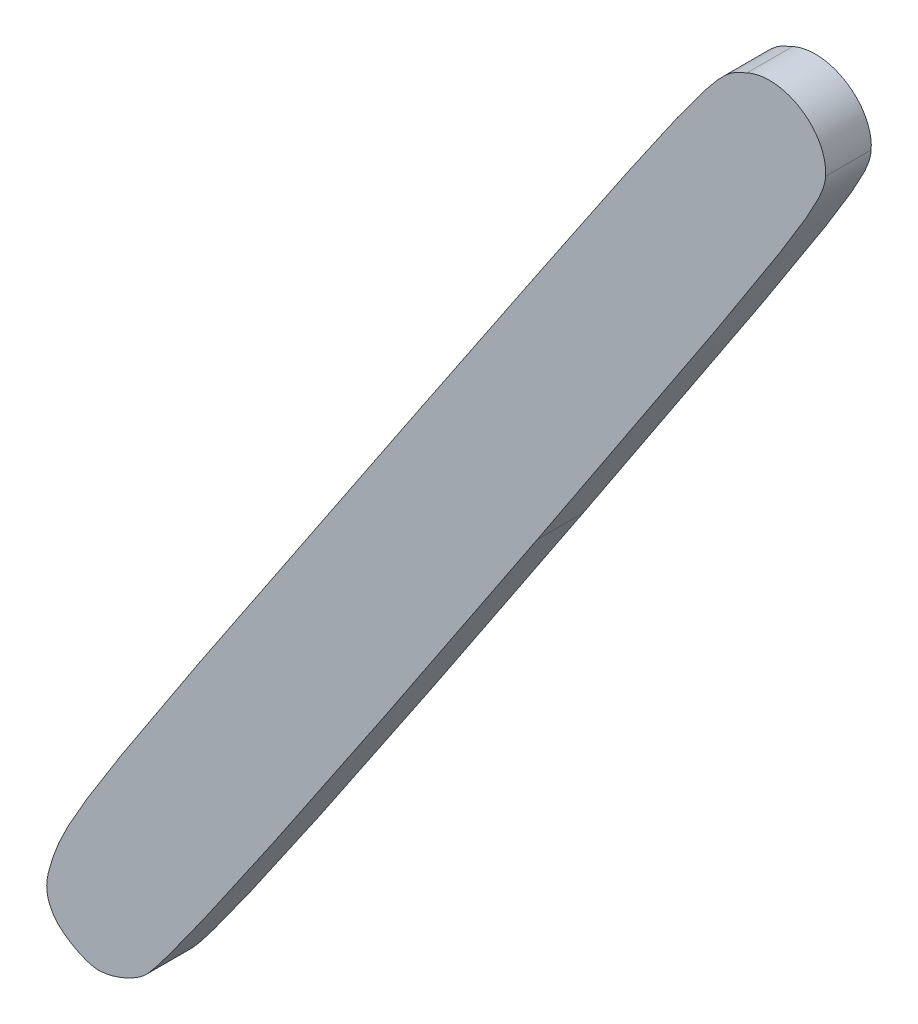
ISO-10303-21;
HEADER;
FILE_DESCRIPTION(('STEP AP214'),'2;1');
FILE_NAME('part.step','',(''),(''),'','','');
FILE_SCHEMA(('AUTOMOTIVE_DESIGN { 1 0 10303 214 1 1 1 1 }'));
ENDSEC;
DATA;
#1=APPLICATION_CONTEXT('core data for automotive mechanical design processes');
#2=APPLICATION_PROTOCOL_DEFINITION('international standard','automotive_design',2000,#1);
#3=PRODUCT_CONTEXT('',#1,'mechanical');
#4=PRODUCT('Part','Part','',(#3));
#5=PRODUCT_RELATED_PRODUCT_CATEGORY('part','',(#4));
#6=PRODUCT_DEFINITION_FORMATION('','',#4);
#7=PRODUCT_DEFINITION_CONTEXT('part definition',#1,'design');
#8=PRODUCT_DEFINITION('design','',#6,#7);
#9=PRODUCT_DEFINITION_SHAPE('','',#8);
#10=(LENGTH_UNIT() NAMED_UNIT(*) SI_UNIT(.MILLI.,.METRE.));
#11=(NAMED_UNIT(*) PLANE_ANGLE_UNIT() SI_UNIT($,.RADIAN.));
#12=(NAMED_UNIT(*) SI_UNIT($,.STERADIAN.) SOLID_ANGLE_UNIT());
#13=UNCERTAINTY_MEASURE_WITH_UNIT(LENGTH_MEASURE(1.E-05),#10,'distance_accuracy_value','');
#14=(GEOMETRIC_REPRESENTATION_CONTEXT(3) GLOBAL_UNCERTAINTY_ASSIGNED_CONTEXT((#13)) GLOBAL_UNIT_ASSIGNED_CONTEXT((#10,
#11,#12)) REPRESENTATION_CONTEXT('',''));
#15=CARTESIAN_POINT('',(0.,0.,0.));
#16=DIRECTION('',(0.,0.,1.));
#17=DIRECTION('',(1.,0.,0.));
#18=AXIS2_PLACEMENT_3D('',#15,#16,#17);
#19=CARTESIAN_POINT('',(-3.363204408535,-1.493037371071,0.));
#20=CARTESIAN_POINT('',(-3.363204408535,-1.493037371071,0.01));
#21=CARTESIAN_POINT('',(-3.370469439906,-1.496277458136,0.));
#22=CARTESIAN_POINT('',(-3.370469439906,-1.496277458136,0.01));
#23=CARTESIAN_POINT('',(-3.367841194732,-1.492614738418,0.));
#24=CARTESIAN_POINT('',(-3.367841194732,-1.492614738418,0.01));
#25=CARTESIAN_POINT('',(-3.43794680232,-1.597198231077,0.));
#26=CARTESIAN_POINT('',(-3.43794680232,-1.597198231077,0.01));
#27=B_SPLINE_SURFACE_WITH_KNOTS('',3,1,((#19,#20),(#21,#22),(#23,#24),(#25,#26)),.UNSPECIFIED.,
.F.,.F.,.F.,(4,4),(2,2),(0.,1.),(0.,0.001),.UNSPECIFIED.);
#28=CARTESIAN_POINT('',(-3.363204408535,-1.493037371071,0.));
#29=CARTESIAN_POINT('',(-3.370469439906,-1.496277458136,0.));
#30=CARTESIAN_POINT('',(-3.367841194732,-1.492614738418,0.));
#31=CARTESIAN_POINT('',(-3.43794680232,-1.597198231077,0.));
#32=B_SPLINE_CURVE_WITH_KNOTS('',3,(#28,#29,#30,#31),.UNSPECIFIED.,.F.,.F.,(4,4),(0.,1.),.UNSPECIFIED.);
#33=CARTESIAN_POINT('',(-3.363204408535,-1.493037371071,0.));
#34=VERTEX_POINT('',#33);
#35=CARTESIAN_POINT('',(-3.43794680232,-1.597198231077,0.));
#36=VERTEX_POINT('',#35);
#37=EDGE_CURVE('E11',#34,#36,#32,.T.);
#38=DIRECTION('',(0.,0.,1.));
#39=VECTOR('',#38,1.);
#40=CARTESIAN_POINT('',(-3.43794680232,-1.597198231077,0.));
#41=LINE('',#40,#39);
#42=CARTESIAN_POINT('',(-3.43794680232,-1.597198231077,0.01));
#43=VERTEX_POINT('',#42);
#44=EDGE_CURVE('E28',#36,#43,#41,.T.);
#45=CARTESIAN_POINT('',(-3.363204408535,-1.493037371071,0.01));
#46=CARTESIAN_POINT('',(-3.370469439906,-1.496277458136,0.01));
#47=CARTESIAN_POINT('',(-3.367841194732,-1.492614738418,0.01));
#48=CARTESIAN_POINT('',(-3.43794680232,-1.597198231077,0.01));
#49=B_SPLINE_CURVE_WITH_KNOTS('',3,(#45,#46,#47,#48),.UNSPECIFIED.,.F.,.F.,(4,4),(0.,1.),.UNSPECIFIED.);
#50=CARTESIAN_POINT('',(-3.363204408535,-1.493037371071,0.01));
#51=VERTEX_POINT('',#50);
#52=EDGE_CURVE('E104',#51,#43,#49,.T.);
#53=DIRECTION('',(0.,0.,1.));
#54=VECTOR('',#53,1.);
#55=CARTESIAN_POINT('',(-3.363204408535,-1.493037371071,0.));
#56=LINE('',#55,#54);
#57=EDGE_CURVE('E217',#34,#51,#56,.T.);
#58=ORIENTED_EDGE('',*,*,#37,.T.);
#59=ORIENTED_EDGE('',*,*,#44,.T.);
#60=ORIENTED_EDGE('',*,*,#52,.F.);
#61=ORIENTED_EDGE('',*,*,#57,.F.);
#62=EDGE_LOOP('',(#58,#59,#60,#61));
#63=FACE_BOUND('',#62,.T.);
#64=ADVANCED_FACE('F17',(#63),#27,.T.);
#65=CARTESIAN_POINT('',(-3.346025772482,-1.504066626343,0.));
#66=CARTESIAN_POINT('',(-3.346025772482,-1.504066626343,0.01));
#67=CARTESIAN_POINT('',(-3.345477865455,-1.495616921893,0.));
#68=CARTESIAN_POINT('',(-3.345477865455,-1.495616921893,0.01));
#69=CARTESIAN_POINT('',(-3.355114958135,-1.489429590917,0.));
#70=CARTESIAN_POINT('',(-3.355114958135,-1.489429590917,0.01));
#71=CARTESIAN_POINT('',(-3.363204408535,-1.493037371071,0.));
#72=CARTESIAN_POINT('',(-3.363204408535,-1.493037371071,0.01));
#73=B_SPLINE_SURFACE_WITH_KNOTS('',3,1,((#65,#66),(#67,#68),(#69,#70),(#71,#72)),.UNSPECIFIED.,
.F.,.F.,.F.,(4,4),(2,2),(0.,1.),(0.,0.001),.UNSPECIFIED.);
#74=CARTESIAN_POINT('',(-3.346025772482,-1.504066626343,0.));
#75=CARTESIAN_POINT('',(-3.345477865455,-1.495616921893,0.));
#76=CARTESIAN_POINT('',(-3.355114958135,-1.489429590917,0.));
#77=CARTESIAN_POINT('',(-3.363204408535,-1.493037371071,0.));
#78=B_SPLINE_CURVE_WITH_KNOTS('',3,(#74,#75,#76,#77),.UNSPECIFIED.,.F.,.F.,(4,4),(0.,1.),.UNSPECIFIED.);
#79=CARTESIAN_POINT('',(-3.346025772482,-1.504066626343,0.));
#80=VERTEX_POINT('',#79);
#81=EDGE_CURVE('E209',#80,#34,#78,.T.);
#82=CARTESIAN_POINT('',(-3.346025772482,-1.504066626343,0.01));
#83=CARTESIAN_POINT('',(-3.345477865455,-1.495616921893,0.01));
#84=CARTESIAN_POINT('',(-3.355114958135,-1.489429590917,0.01));
#85=CARTESIAN_POINT('',(-3.363204408535,-1.493037371071,0.01));
#86=B_SPLINE_CURVE_WITH_KNOTS('',3,(#82,#83,#84,#85),.UNSPECIFIED.,.F.,.F.,(4,4),(0.,1.),.UNSPECIFIED.);
#87=CARTESIAN_POINT('',(-3.346025772482,-1.504066626343,0.01));
#88=VERTEX_POINT('',#87);
#89=EDGE_CURVE('E205',#88,#51,#86,.T.);
#90=DIRECTION('',(0.,0.,1.));
#91=VECTOR('',#90,1.);
#92=CARTESIAN_POINT('',(-3.346025772482,-1.504066626343,0.));
#93=LINE('',#92,#91);
#94=EDGE_CURVE('E199',#80,#88,#93,.T.);
#95=ORIENTED_EDGE('',*,*,#81,.T.);
#96=ORIENTED_EDGE('',*,*,#57,.T.);
#97=ORIENTED_EDGE('',*,*,#89,.F.);
#98=ORIENTED_EDGE('',*,*,#94,.F.);
#99=EDGE_LOOP('',(#95,#96,#97,#98));
#100=FACE_BOUND('',#99,.T.);
#101=ADVANCED_FACE('F242',(#100),#73,.T.);
#102=CARTESIAN_POINT('',(-3.409126513595,-1.604467217313,0.));
#103=CARTESIAN_POINT('',(-3.409126513595,-1.604467217313,0.01));
#104=CARTESIAN_POINT('',(-3.351204575032,-1.517049252958,0.));
#105=CARTESIAN_POINT('',(-3.351204575032,-1.517049252958,0.01));
#106=CARTESIAN_POINT('',(-3.346368669837,-1.509354778062,0.));
#107=CARTESIAN_POINT('',(-3.346368669837,-1.509354778062,0.01));
#108=CARTESIAN_POINT('',(-3.346025772482,-1.504066626343,0.));
#109=CARTESIAN_POINT('',(-3.346025772482,-1.504066626343,0.01));
#110=B_SPLINE_SURFACE_WITH_KNOTS('',3,1,((#102,#103),(#104,#105),(#106,#107),(#108,#109)),
.UNSPECIFIED.,.F.,.F.,.F.,(4,4),(2,2),(0.,1.),(0.,0.001),.UNSPECIFIED.);
#111=CARTESIAN_POINT('',(-3.409126513595,-1.604467217313,0.));
#112=CARTESIAN_POINT('',(-3.351204575032,-1.517049252958,0.));
#113=CARTESIAN_POINT('',(-3.346368669837,-1.509354778062,0.));
#114=CARTESIAN_POINT('',(-3.346025772482,-1.504066626343,0.));
#115=B_SPLINE_CURVE_WITH_KNOTS('',3,(#111,#112,#113,#114),.UNSPECIFIED.,.F.,.F.,(4,4),(0.,1.),.UNSPECIFIED.);
#116=CARTESIAN_POINT('',(-3.409126513595,-1.604467217313,0.));
#117=VERTEX_POINT('',#116);
#118=EDGE_CURVE('E191',#117,#80,#115,.T.);
#119=CARTESIAN_POINT('',(-3.409126513595,-1.604467217313,0.01));
#120=CARTESIAN_POINT('',(-3.351204575032,-1.517049252958,0.01));
#121=CARTESIAN_POINT('',(-3.346368669837,-1.509354778062,0.01));
#122=CARTESIAN_POINT('',(-3.346025772482,-1.504066626343,0.01));
#123=B_SPLINE_CURVE_WITH_KNOTS('',3,(#119,#120,#121,#122),.UNSPECIFIED.,.F.,.F.,(4,4),(0.,1.),.UNSPECIFIED.);
#124=CARTESIAN_POINT('',(-3.409126513595,-1.604467217313,0.01));
#125=VERTEX_POINT('',#124);
#126=EDGE_CURVE('E186',#125,#88,#123,.T.);
#127=DIRECTION('',(0.,0.,1.));
#128=VECTOR('',#127,1.);
#129=CARTESIAN_POINT('',(-3.409126513595,-1.604467217313,0.));
#130=LINE('',#129,#128);
#131=EDGE_CURVE('E180',#117,#125,#130,.T.);
#132=ORIENTED_EDGE('',*,*,#118,.T.);
#133=ORIENTED_EDGE('',*,*,#94,.T.);
#134=ORIENTED_EDGE('',*,*,#126,.F.);
#135=ORIENTED_EDGE('',*,*,#131,.F.);
#136=EDGE_LOOP('',(#132,#133,#134,#135));
#137=FACE_BOUND('',#136,.T.);
#138=ADVANCED_FACE('F239',(#137),#110,.T.);
#139=CARTESIAN_POINT('',(-3.495259882787,-1.730248698032,0.));
#140=CARTESIAN_POINT('',(-3.495259882787,-1.730248698032,0.01));
#141=CARTESIAN_POINT('',(-3.490998030274,-1.72671930422,0.));
#142=CARTESIAN_POINT('',(-3.490998030274,-1.72671930422,0.01));
#143=CARTESIAN_POINT('',(-3.464193178519,-1.687575888235,0.));
#144=CARTESIAN_POINT('',(-3.464193178519,-1.687575888235,0.01));
#145=CARTESIAN_POINT('',(-3.409126513595,-1.604467217313,0.));
#146=CARTESIAN_POINT('',(-3.409126513595,-1.604467217313,0.01));
#147=B_SPLINE_SURFACE_WITH_KNOTS('',3,1,((#139,#140),(#141,#142),(#143,#144),(#145,#146)),
.UNSPECIFIED.,.F.,.F.,.F.,(4,4),(2,2),(0.,1.),(0.,0.001),.UNSPECIFIED.);
#148=CARTESIAN_POINT('',(-3.495259882787,-1.730248698032,0.));
#149=CARTESIAN_POINT('',(-3.490998030274,-1.72671930422,0.));
#150=CARTESIAN_POINT('',(-3.464193178519,-1.687575888235,0.));
#151=CARTESIAN_POINT('',(-3.409126513595,-1.604467217313,0.));
#152=B_SPLINE_CURVE_WITH_KNOTS('',3,(#148,#149,#150,#151),.UNSPECIFIED.,.F.,.F.,(4,4),(0.,1.),.UNSPECIFIED.);
#153=CARTESIAN_POINT('',(-3.495259882787,-1.730248698032,0.));
#154=VERTEX_POINT('',#153);
#155=EDGE_CURVE('E172',#154,#117,#152,.T.);
#156=CARTESIAN_POINT('',(-3.495259882787,-1.730248698032,0.01));
#157=CARTESIAN_POINT('',(-3.490998030274,-1.72671930422,0.01));
#158=CARTESIAN_POINT('',(-3.464193178519,-1.687575888235,0.01));
#159=CARTESIAN_POINT('',(-3.409126513595,-1.604467217313,0.01));
#160=B_SPLINE_CURVE_WITH_KNOTS('',3,(#156,#157,#158,#159),.UNSPECIFIED.,.F.,.F.,(4,4),(0.,1.),.UNSPECIFIED.);
#161=CARTESIAN_POINT('',(-3.495259882787,-1.730248698032,0.01));
#162=VERTEX_POINT('',#161);
#163=EDGE_CURVE('E167',#162,#125,#160,.T.);
#164=DIRECTION('',(0.,0.,1.));
#165=VECTOR('',#164,1.);
#166=CARTESIAN_POINT('',(-3.495259882787,-1.730248698032,0.));
#167=LINE('',#166,#165);
#168=EDGE_CURVE('E161',#154,#162,#167,.T.);
#169=ORIENTED_EDGE('',*,*,#155,.T.);
#170=ORIENTED_EDGE('',*,*,#131,.T.);
#171=ORIENTED_EDGE('',*,*,#163,.F.);
#172=ORIENTED_EDGE('',*,*,#168,.F.);
#173=EDGE_LOOP('',(#169,#170,#171,#172));
#174=FACE_BOUND('',#173,.T.);
#175=ADVANCED_FACE('F236',(#174),#147,.T.);
#176=CARTESIAN_POINT('',(-3.504956956897,-1.734200969805,0.));
#177=CARTESIAN_POINT('',(-3.504956956897,-1.734200969805,0.01));
#178=CARTESIAN_POINT('',(-3.501881399519,-1.734049101498,0.));
#179=CARTESIAN_POINT('',(-3.501881399519,-1.734049101498,0.01));
#180=CARTESIAN_POINT('',(-3.497879346239,-1.73241794344,0.));
#181=CARTESIAN_POINT('',(-3.497879346239,-1.73241794344,0.01));
#182=CARTESIAN_POINT('',(-3.495259882787,-1.730248698032,0.));
#183=CARTESIAN_POINT('',(-3.495259882787,-1.730248698032,0.01));
#184=B_SPLINE_SURFACE_WITH_KNOTS('',3,1,((#176,#177),(#178,#179),(#180,#181),(#182,#183)),
.UNSPECIFIED.,.F.,.F.,.F.,(4,4),(2,2),(0.,1.),(0.,0.001),.UNSPECIFIED.);
#185=CARTESIAN_POINT('',(-3.504956956897,-1.734200969805,0.));
#186=CARTESIAN_POINT('',(-3.501881399519,-1.734049101498,0.));
#187=CARTESIAN_POINT('',(-3.497879346239,-1.73241794344,0.));
#188=CARTESIAN_POINT('',(-3.495259882787,-1.730248698032,0.));
#189=B_SPLINE_CURVE_WITH_KNOTS('',3,(#185,#186,#187,#188),.UNSPECIFIED.,.F.,.F.,(4,4),(0.,1.),.UNSPECIFIED.);
#190=CARTESIAN_POINT('',(-3.504956956897,-1.734200969805,0.));
#191=VERTEX_POINT('',#190);
#192=EDGE_CURVE('E153',#191,#154,#189,.T.);
#193=CARTESIAN_POINT('',(-3.504956956897,-1.734200969805,0.01));
#194=CARTESIAN_POINT('',(-3.501881399519,-1.734049101498,0.01));
#195=CARTESIAN_POINT('',(-3.497879346239,-1.73241794344,0.01));
#196=CARTESIAN_POINT('',(-3.495259882787,-1.730248698032,0.01));
#197=B_SPLINE_CURVE_WITH_KNOTS('',3,(#193,#194,#195,#196),.UNSPECIFIED.,.F.,.F.,(4,4),(0.,1.),.UNSPECIFIED.);
#198=CARTESIAN_POINT('',(-3.504956956897,-1.734200969805,0.01));
#199=VERTEX_POINT('',#198);
#200=EDGE_CURVE('E148',#199,#162,#197,.T.);
#201=DIRECTION('',(0.,0.,1.));
#202=VECTOR('',#201,1.);
#203=CARTESIAN_POINT('',(-3.504956956897,-1.734200969805,0.));
#204=LINE('',#203,#202);
#205=EDGE_CURVE('E142',#191,#199,#204,.T.);
#206=ORIENTED_EDGE('',*,*,#192,.T.);
#207=ORIENTED_EDGE('',*,*,#168,.T.);
#208=ORIENTED_EDGE('',*,*,#200,.F.);
#209=ORIENTED_EDGE('',*,*,#205,.F.);
#210=EDGE_LOOP('',(#206,#207,#208,#209));
#211=FACE_BOUND('',#210,.T.);
#212=ADVANCED_FACE('F233',(#211),#184,.T.);
#213=CARTESIAN_POINT('',(-3.515107951758,-1.728566809935,0.));
#214=CARTESIAN_POINT('',(-3.515107951758,-1.728566809935,0.01));
#215=CARTESIAN_POINT('',(-3.513405786965,-1.731333447629,0.));
#216=CARTESIAN_POINT('',(-3.513405786965,-1.731333447629,0.01));
#217=CARTESIAN_POINT('',(-3.507971168558,-1.734349784325,0.));
#218=CARTESIAN_POINT('',(-3.507971168558,-1.734349784325,0.01));
#219=CARTESIAN_POINT('',(-3.504956956897,-1.734200969805,0.));
#220=CARTESIAN_POINT('',(-3.504956956897,-1.734200969805,0.01));
#221=B_SPLINE_SURFACE_WITH_KNOTS('',3,1,((#213,#214),(#215,#216),(#217,#218),(#219,#220)),
.UNSPECIFIED.,.F.,.F.,.F.,(4,4),(2,2),(0.,1.),(0.,0.001),.UNSPECIFIED.);
#222=CARTESIAN_POINT('',(-3.515107951758,-1.728566809935,0.));
#223=CARTESIAN_POINT('',(-3.513405786965,-1.731333447629,0.));
#224=CARTESIAN_POINT('',(-3.507971168558,-1.734349784325,0.));
#225=CARTESIAN_POINT('',(-3.504956956897,-1.734200969805,0.));
#226=B_SPLINE_CURVE_WITH_KNOTS('',3,(#222,#223,#224,#225),.UNSPECIFIED.,.F.,.F.,(4,4),(0.,1.),.UNSPECIFIED.);
#227=CARTESIAN_POINT('',(-3.515107951758,-1.728566809935,0.));
#228=VERTEX_POINT('',#227);
#229=EDGE_CURVE('E134',#228,#191,#226,.T.);
#230=CARTESIAN_POINT('',(-3.515107951758,-1.728566809935,0.01));
#231=CARTESIAN_POINT('',(-3.513405786965,-1.731333447629,0.01));
#232=CARTESIAN_POINT('',(-3.507971168558,-1.734349784325,0.01));
#233=CARTESIAN_POINT('',(-3.504956956897,-1.734200969805,0.01));
#234=B_SPLINE_CURVE_WITH_KNOTS('',3,(#230,#231,#232,#233),.UNSPECIFIED.,.F.,.F.,(4,4),(0.,1.),.UNSPECIFIED.);
#235=CARTESIAN_POINT('',(-3.515107951758,-1.728566809935,0.01));
#236=VERTEX_POINT('',#235);
#237=EDGE_CURVE('E130',#236,#199,#234,.T.);
#238=DIRECTION('',(0.,0.,1.));
#239=VECTOR('',#238,1.);
#240=CARTESIAN_POINT('',(-3.515107951758,-1.728566809935,0.));
#241=LINE('',#240,#239);
#242=EDGE_CURVE('E89',#228,#236,#241,.T.);
#243=ORIENTED_EDGE('',*,*,#229,.T.);
#244=ORIENTED_EDGE('',*,*,#205,.T.);
#245=ORIENTED_EDGE('',*,*,#237,.F.);
#246=ORIENTED_EDGE('',*,*,#242,.F.);
#247=EDGE_LOOP('',(#243,#244,#245,#246));
#248=FACE_BOUND('',#247,.T.);
#249=ADVANCED_FACE('F231',(#248),#221,.T.);
#250=CARTESIAN_POINT('',(-3.515158415349,-1.717641420715,0.));
#251=CARTESIAN_POINT('',(-3.515158415349,-1.717641420715,0.01));
#252=CARTESIAN_POINT('',(-3.517028204711,-1.723074718512,0.));
#253=CARTESIAN_POINT('',(-3.517028204711,-1.723074718512,0.01));
#254=CARTESIAN_POINT('',(-3.517017198257,-1.725463732001,0.));
#255=CARTESIAN_POINT('',(-3.517017198257,-1.725463732001,0.01));
#256=CARTESIAN_POINT('',(-3.515107951758,-1.728566809935,0.));
#257=CARTESIAN_POINT('',(-3.515107951758,-1.728566809935,0.01));
#258=B_SPLINE_SURFACE_WITH_KNOTS('',3,1,((#250,#251),(#252,#253),(#254,#255),(#256,#257)),
.UNSPECIFIED.,.F.,.F.,.F.,(4,4),(2,2),(0.,1.),(0.,0.001),.UNSPECIFIED.);
#259=CARTESIAN_POINT('',(-3.515158415349,-1.717641420715,0.));
#260=CARTESIAN_POINT('',(-3.517028204711,-1.723074718512,0.));
#261=CARTESIAN_POINT('',(-3.517017198257,-1.725463732001,0.));
#262=CARTESIAN_POINT('',(-3.515107951758,-1.728566809935,0.));
#263=B_SPLINE_CURVE_WITH_KNOTS('',3,(#259,#260,#261,#262),.UNSPECIFIED.,.F.,.F.,(4,4),(0.,1.),.UNSPECIFIED.);
#264=CARTESIAN_POINT('',(-3.515158415349,-1.717641420715,0.));
#265=VERTEX_POINT('',#264);
#266=EDGE_CURVE('E93',#265,#228,#263,.T.);
#267=CARTESIAN_POINT('',(-3.515158415349,-1.717641420715,0.01));
#268=CARTESIAN_POINT('',(-3.517028204711,-1.723074718512,0.01));
#269=CARTESIAN_POINT('',(-3.517017198257,-1.725463732001,0.01));
#270=CARTESIAN_POINT('',(-3.515107951758,-1.728566809935,0.01));
#271=B_SPLINE_CURVE_WITH_KNOTS('',3,(#267,#268,#269,#270),.UNSPECIFIED.,.F.,.F.,(4,4),(0.,1.),.UNSPECIFIED.);
#272=CARTESIAN_POINT('',(-3.515158415349,-1.717641420715,0.01));
#273=VERTEX_POINT('',#272);
#274=EDGE_CURVE('E82',#273,#236,#271,.T.);
#275=DIRECTION('',(0.,0.,1.));
#276=VECTOR('',#275,1.);
#277=CARTESIAN_POINT('',(-3.515158415349,-1.717641420715,0.));
#278=LINE('',#277,#276);
#279=EDGE_CURVE('E86',#265,#273,#278,.T.);
#280=ORIENTED_EDGE('',*,*,#266,.T.);
#281=ORIENTED_EDGE('',*,*,#242,.T.);
#282=ORIENTED_EDGE('',*,*,#274,.F.);
#283=ORIENTED_EDGE('',*,*,#279,.F.);
#284=EDGE_LOOP('',(#280,#281,#282,#283));
#285=FACE_BOUND('',#284,.T.);
#286=ADVANCED_FACE('F85',(#285),#258,.T.);
#287=CARTESIAN_POINT('',(-3.43794680232,-1.597198231077,0.));
#288=CARTESIAN_POINT('',(-3.43794680232,-1.597198231077,0.01));
#289=CARTESIAN_POINT('',(-3.504552695589,-1.696560840429,0.));
#290=CARTESIAN_POINT('',(-3.504552695589,-1.696560840429,0.01));
#291=CARTESIAN_POINT('',(-3.511787755046,-1.707846888877,0.));
#292=CARTESIAN_POINT('',(-3.511787755046,-1.707846888877,0.01));
#293=CARTESIAN_POINT('',(-3.515158415349,-1.717641420715,0.));
#294=CARTESIAN_POINT('',(-3.515158415349,-1.717641420715,0.01));
#295=B_SPLINE_SURFACE_WITH_KNOTS('',3,1,((#287,#288),(#289,#290),(#291,#292),(#293,#294)),
.UNSPECIFIED.,.F.,.F.,.F.,(4,4),(2,2),(0.,1.),(0.,0.001),.UNSPECIFIED.);
#296=CARTESIAN_POINT('',(-3.43794680232,-1.597198231077,0.));
#297=CARTESIAN_POINT('',(-3.504552695589,-1.696560840429,0.));
#298=CARTESIAN_POINT('',(-3.511787755046,-1.707846888877,0.));
#299=CARTESIAN_POINT('',(-3.515158415349,-1.717641420715,0.));
#300=B_SPLINE_CURVE_WITH_KNOTS('',3,(#296,#297,#298,#299),.UNSPECIFIED.,.F.,.F.,(4,4),(0.,1.),.UNSPECIFIED.);
#301=EDGE_CURVE('E99',#36,#265,#300,.T.);
#302=CARTESIAN_POINT('',(-3.43794680232,-1.597198231077,0.01));
#303=CARTESIAN_POINT('',(-3.504552695589,-1.696560840429,0.01));
#304=CARTESIAN_POINT('',(-3.511787755046,-1.707846888877,0.01));
#305=CARTESIAN_POINT('',(-3.515158415349,-1.717641420715,0.01));
#306=B_SPLINE_CURVE_WITH_KNOTS('',3,(#302,#303,#304,#305),.UNSPECIFIED.,.F.,.F.,(4,4),(0.,1.),.UNSPECIFIED.);
#307=EDGE_CURVE('E98',#43,#273,#306,.T.);
#308=ORIENTED_EDGE('',*,*,#301,.T.);
#309=ORIENTED_EDGE('',*,*,#279,.T.);
#310=ORIENTED_EDGE('',*,*,#307,.F.);
#311=ORIENTED_EDGE('',*,*,#44,.F.);
#312=EDGE_LOOP('',(#308,#309,#310,#311));
#313=FACE_BOUND('',#312,.T.);
#314=ADVANCED_FACE('F97',(#313),#295,.T.);
#315=CARTESIAN_POINT('',(-3.431541956508,-1.612859210854,0.01));
#316=DIRECTION('',(0.,0.,1.));
#317=DIRECTION('',(1.,0.,0.));
#318=AXIS2_PLACEMENT_3D('',#315,#316,#317);
#319=PLANE('',#318);
#320=ORIENTED_EDGE('',*,*,#307,.T.);
#321=ORIENTED_EDGE('',*,*,#274,.T.);
#322=ORIENTED_EDGE('',*,*,#237,.T.);
#323=ORIENTED_EDGE('',*,*,#200,.T.);
#324=ORIENTED_EDGE('',*,*,#163,.T.);
#325=ORIENTED_EDGE('',*,*,#126,.T.);
#326=ORIENTED_EDGE('',*,*,#89,.T.);
#327=ORIENTED_EDGE('',*,*,#52,.T.);
#328=EDGE_LOOP('',(#320,#321,#322,#323,#324,#325,#326,#327));
#329=FACE_BOUND('',#328,.T.);
#330=ADVANCED_FACE('F102',(#329),#319,.T.);
#331=CARTESIAN_POINT('',(-3.431541956508,-1.612859210854,0.));
#332=DIRECTION('',(0.,0.,1.));
#333=DIRECTION('',(1.,0.,0.));
#334=AXIS2_PLACEMENT_3D('',#331,#332,#333);
#335=PLANE('',#334);
#336=ORIENTED_EDGE('',*,*,#301,.F.);
#337=ORIENTED_EDGE('',*,*,#37,.F.);
#338=ORIENTED_EDGE('',*,*,#81,.F.);
#339=ORIENTED_EDGE('',*,*,#118,.F.);
#340=ORIENTED_EDGE('',*,*,#155,.F.);
#341=ORIENTED_EDGE('',*,*,#192,.F.);
#342=ORIENTED_EDGE('',*,*,#229,.F.);
#343=ORIENTED_EDGE('',*,*,#266,.F.);
#344=EDGE_LOOP('',(#336,#337,#338,#339,#340,#341,#342,#343));
#345=FACE_BOUND('',#344,.T.);
#346=ADVANCED_FACE('F228',(#345),#335,.F.);
#347=CLOSED_SHELL('',(#64,#101,#138,#175,#212,#249,#286,#314,#330,#346));
#348=MANIFOLD_SOLID_BREP('B1',#347);
#349=ADVANCED_BREP_SHAPE_REPRESENTATION('',(#18,#348),#14);
#350=SHAPE_DEFINITION_REPRESENTATION(#9,#349);
ENDSEC;
END-ISO-10303-21;
